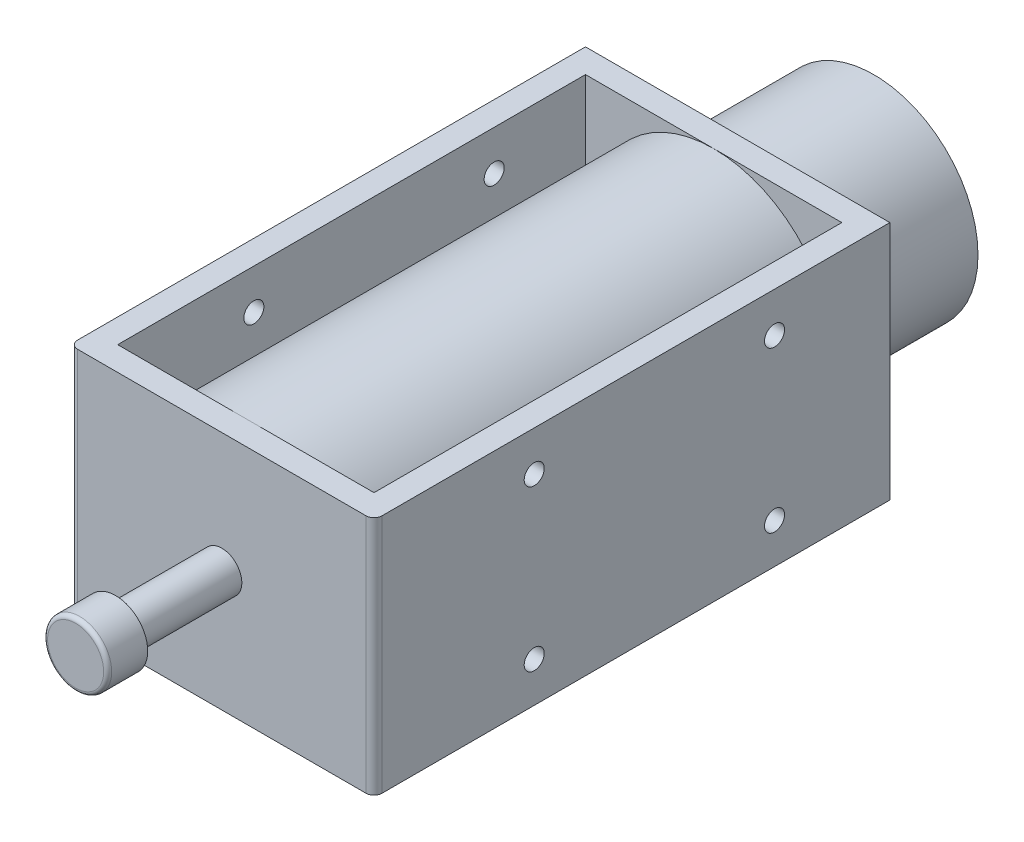
ISO-10303-21;
HEADER;
FILE_DESCRIPTION(('STEP AP214'),'2;1');
FILE_NAME('part.step','',(''),(''),'','','');
FILE_SCHEMA(('AUTOMOTIVE_DESIGN { 1 0 10303 214 1 1 1 1 }'));
ENDSEC;
DATA;
#1=APPLICATION_CONTEXT('core data for automotive mechanical design processes');
#2=APPLICATION_PROTOCOL_DEFINITION('international standard','automotive_design',2000,#1);
#3=PRODUCT_CONTEXT('',#1,'mechanical');
#4=PRODUCT('Part','Part','',(#3));
#5=PRODUCT_RELATED_PRODUCT_CATEGORY('part','',(#4));
#6=PRODUCT_DEFINITION_FORMATION('','',#4);
#7=PRODUCT_DEFINITION_CONTEXT('part definition',#1,'design');
#8=PRODUCT_DEFINITION('design','',#6,#7);
#9=PRODUCT_DEFINITION_SHAPE('','',#8);
#10=(LENGTH_UNIT() NAMED_UNIT(*) SI_UNIT(.MILLI.,.METRE.));
#11=(NAMED_UNIT(*) PLANE_ANGLE_UNIT() SI_UNIT($,.RADIAN.));
#12=(NAMED_UNIT(*) SI_UNIT($,.STERADIAN.) SOLID_ANGLE_UNIT());
#13=UNCERTAINTY_MEASURE_WITH_UNIT(LENGTH_MEASURE(1.E-05),#10,'distance_accuracy_value','');
#14=(GEOMETRIC_REPRESENTATION_CONTEXT(3) GLOBAL_UNCERTAINTY_ASSIGNED_CONTEXT((#13)) GLOBAL_UNIT_ASSIGNED_CONTEXT((#10,
#11,#12)) REPRESENTATION_CONTEXT('',''));
#15=CARTESIAN_POINT('',(0.,0.,0.));
#16=DIRECTION('',(0.,0.,1.));
#17=DIRECTION('',(1.,0.,0.));
#18=AXIS2_PLACEMENT_3D('',#15,#16,#17);
#19=CARTESIAN_POINT('',(19.,-15.,64.4));
#20=DIRECTION('',(-1.,0.,0.));
#21=DIRECTION('',(0.,0.,1.));
#22=AXIS2_PLACEMENT_3D('',#19,#20,#21);
#23=PLANE('',#22);
#24=CARTESIAN_POINT('',(19.,-10.,14.4));
#25=DIRECTION('',(1.,0.,0.));
#26=DIRECTION('',(0.,0.,-1.));
#27=AXIS2_PLACEMENT_3D('',#24,#25,#26);
#28=CIRCLE('',#27,1.24999999999999);
#29=CARTESIAN_POINT('',(19.,-10.,13.15));
#30=VERTEX_POINT('',#29);
#31=EDGE_CURVE('E401',#30,#30,#28,.T.);
#32=ORIENTED_EDGE('',*,*,#31,.F.);
#33=EDGE_LOOP('',(#32));
#34=FACE_BOUND('',#33,.T.);
#35=CARTESIAN_POINT('',(19.,-10.,44.4));
#36=DIRECTION('',(1.,0.,0.));
#37=DIRECTION('',(0.,0.,-1.));
#38=AXIS2_PLACEMENT_3D('',#35,#36,#37);
#39=CIRCLE('',#38,1.24999999999999);
#40=CARTESIAN_POINT('',(19.,-10.,43.15));
#41=VERTEX_POINT('',#40);
#42=EDGE_CURVE('E407',#41,#41,#39,.T.);
#43=ORIENTED_EDGE('',*,*,#42,.F.);
#44=EDGE_LOOP('',(#43));
#45=FACE_BOUND('',#44,.T.);
#46=CARTESIAN_POINT('',(19.,10.,44.4));
#47=DIRECTION('',(1.,0.,0.));
#48=DIRECTION('',(0.,0.,-1.));
#49=AXIS2_PLACEMENT_3D('',#46,#47,#48);
#50=CIRCLE('',#49,1.24999999999999);
#51=CARTESIAN_POINT('',(19.,10.,43.15));
#52=VERTEX_POINT('',#51);
#53=EDGE_CURVE('E413',#52,#52,#50,.T.);
#54=ORIENTED_EDGE('',*,*,#53,.F.);
#55=EDGE_LOOP('',(#54));
#56=FACE_BOUND('',#55,.T.);
#57=DIRECTION('',(0.,0.,-1.));
#58=VECTOR('',#57,1.);
#59=CARTESIAN_POINT('',(19.,15.,64.4));
#60=LINE('',#59,#58);
#61=CARTESIAN_POINT('',(19.,15.,63.4));
#62=VERTEX_POINT('',#61);
#63=CARTESIAN_POINT('',(19.,15.,0.));
#64=VERTEX_POINT('',#63);
#65=EDGE_CURVE('E160',#62,#64,#60,.T.);
#66=ORIENTED_EDGE('',*,*,#65,.F.);
#67=DIRECTION('',(0.,1.,0.));
#68=VECTOR('',#67,1.);
#69=CARTESIAN_POINT('',(19.,-15.,63.4));
#70=LINE('',#69,#68);
#71=CARTESIAN_POINT('',(19.,-15.,63.4));
#72=VERTEX_POINT('',#71);
#73=EDGE_CURVE('E64',#62,#72,#70,.F.);
#74=ORIENTED_EDGE('',*,*,#73,.T.);
#75=DIRECTION('',(0.,0.,-1.));
#76=VECTOR('',#75,1.);
#77=CARTESIAN_POINT('',(19.,-15.,64.4));
#78=LINE('',#77,#76);
#79=CARTESIAN_POINT('',(19.,-15.,0.));
#80=VERTEX_POINT('',#79);
#81=EDGE_CURVE('E214',#72,#80,#78,.T.);
#82=ORIENTED_EDGE('',*,*,#81,.T.);
#83=DIRECTION('',(0.,1.,0.));
#84=VECTOR('',#83,1.);
#85=CARTESIAN_POINT('',(19.,-15.,0.));
#86=LINE('',#85,#84);
#87=EDGE_CURVE('E204',#80,#64,#86,.T.);
#88=ORIENTED_EDGE('',*,*,#87,.T.);
#89=EDGE_LOOP('',(#66,#74,#82,#88));
#90=FACE_BOUND('',#89,.T.);
#91=CARTESIAN_POINT('',(19.,10.,14.4));
#92=DIRECTION('',(1.,0.,0.));
#93=DIRECTION('',(0.,0.,-1.));
#94=AXIS2_PLACEMENT_3D('',#91,#92,#93);
#95=CIRCLE('',#94,1.24999999999999);
#96=CARTESIAN_POINT('',(19.,10.,13.15));
#97=VERTEX_POINT('',#96);
#98=EDGE_CURVE('E389',#97,#97,#95,.T.);
#99=ORIENTED_EDGE('',*,*,#98,.F.);
#100=EDGE_LOOP('',(#99));
#101=FACE_BOUND('',#100,.T.);
#102=ADVANCED_FACE('F41',(#34,#45,#56,#90,#101),#23,.F.);
#103=CARTESIAN_POINT('',(-19.,-15.,64.4));
#104=DIRECTION('',(1.,0.,0.));
#105=DIRECTION('',(0.,0.,-1.));
#106=AXIS2_PLACEMENT_3D('',#103,#104,#105);
#107=PLANE('',#106);
#108=CARTESIAN_POINT('',(-19.,10.,44.4));
#109=DIRECTION('',(-1.,0.,0.));
#110=DIRECTION('',(0.,0.,1.));
#111=AXIS2_PLACEMENT_3D('',#108,#109,#110);
#112=CIRCLE('',#111,1.25);
#113=CARTESIAN_POINT('',(-19.,10.,45.65));
#114=VERTEX_POINT('',#113);
#115=EDGE_CURVE('E431',#114,#114,#112,.T.);
#116=ORIENTED_EDGE('',*,*,#115,.F.);
#117=EDGE_LOOP('',(#116));
#118=FACE_BOUND('',#117,.T.);
#119=CARTESIAN_POINT('',(-19.,10.,14.4));
#120=DIRECTION('',(-1.,0.,0.));
#121=DIRECTION('',(0.,0.,1.));
#122=AXIS2_PLACEMENT_3D('',#119,#120,#121);
#123=CIRCLE('',#122,1.25);
#124=CARTESIAN_POINT('',(-19.,10.,15.65));
#125=VERTEX_POINT('',#124);
#126=EDGE_CURVE('E170',#125,#125,#123,.T.);
#127=ORIENTED_EDGE('',*,*,#126,.F.);
#128=EDGE_LOOP('',(#127));
#129=FACE_BOUND('',#128,.T.);
#130=DIRECTION('',(0.,0.,-1.));
#131=VECTOR('',#130,1.);
#132=CARTESIAN_POINT('',(-19.,-15.,64.4));
#133=LINE('',#132,#131);
#134=CARTESIAN_POINT('',(-19.,-15.,63.4));
#135=VERTEX_POINT('',#134);
#136=CARTESIAN_POINT('',(-19.,-15.,0.));
#137=VERTEX_POINT('',#136);
#138=EDGE_CURVE('E226',#135,#137,#133,.T.);
#139=ORIENTED_EDGE('',*,*,#138,.F.);
#140=DIRECTION('',(0.,-1.,0.));
#141=VECTOR('',#140,1.);
#142=CARTESIAN_POINT('',(-19.,-15.,63.4));
#143=LINE('',#142,#141);
#144=CARTESIAN_POINT('',(-19.,15.,63.4));
#145=VERTEX_POINT('',#144);
#146=EDGE_CURVE('E244',#135,#145,#143,.F.);
#147=ORIENTED_EDGE('',*,*,#146,.T.);
#148=DIRECTION('',(0.,0.,-1.));
#149=VECTOR('',#148,1.);
#150=CARTESIAN_POINT('',(-19.,15.,64.4));
#151=LINE('',#150,#149);
#152=CARTESIAN_POINT('',(-19.,15.,0.));
#153=VERTEX_POINT('',#152);
#154=EDGE_CURVE('E228',#145,#153,#151,.T.);
#155=ORIENTED_EDGE('',*,*,#154,.T.);
#156=DIRECTION('',(0.,-1.,0.));
#157=VECTOR('',#156,1.);
#158=CARTESIAN_POINT('',(-19.,-15.,0.));
#159=LINE('',#158,#157);
#160=EDGE_CURVE('E220',#153,#137,#159,.T.);
#161=ORIENTED_EDGE('',*,*,#160,.T.);
#162=EDGE_LOOP('',(#139,#147,#155,#161));
#163=FACE_BOUND('',#162,.T.);
#164=CARTESIAN_POINT('',(-19.,-10.,44.4));
#165=DIRECTION('',(-1.,0.,0.));
#166=DIRECTION('',(0.,0.,1.));
#167=AXIS2_PLACEMENT_3D('',#164,#165,#166);
#168=CIRCLE('',#167,1.25);
#169=CARTESIAN_POINT('',(-19.,-10.,45.65));
#170=VERTEX_POINT('',#169);
#171=EDGE_CURVE('E425',#170,#170,#168,.T.);
#172=ORIENTED_EDGE('',*,*,#171,.F.);
#173=EDGE_LOOP('',(#172));
#174=FACE_BOUND('',#173,.T.);
#175=CARTESIAN_POINT('',(-19.,-10.,14.4));
#176=DIRECTION('',(-1.,0.,0.));
#177=DIRECTION('',(0.,0.,1.));
#178=AXIS2_PLACEMENT_3D('',#175,#176,#177);
#179=CIRCLE('',#178,1.25);
#180=CARTESIAN_POINT('',(-19.,-10.,15.65));
#181=VERTEX_POINT('',#180);
#182=EDGE_CURVE('E419',#181,#181,#179,.T.);
#183=ORIENTED_EDGE('',*,*,#182,.F.);
#184=EDGE_LOOP('',(#183));
#185=FACE_BOUND('',#184,.T.);
#186=ADVANCED_FACE('F261',(#118,#129,#163,#174,#185),#107,.F.);
#187=CARTESIAN_POINT('',(-16.,15.,3.));
#188=DIRECTION('',(0.,0.,-1.));
#189=DIRECTION('',(-1.,0.,0.));
#190=AXIS2_PLACEMENT_3D('',#187,#188,#189);
#191=PLANE('',#190);
#192=CARTESIAN_POINT('',(0.,0.,3.));
#193=DIRECTION('',(0.,0.,-1.));
#194=DIRECTION('',(-1.,0.,0.));
#195=AXIS2_PLACEMENT_3D('',#192,#193,#194);
#196=CIRCLE('',#195,15.);
#197=CARTESIAN_POINT('',(0.,15.,3.));
#198=VERTEX_POINT('',#197);
#199=CARTESIAN_POINT('',(0.,-15.,3.));
#200=VERTEX_POINT('',#199);
#201=EDGE_CURVE('E167',#198,#200,#196,.T.);
#202=ORIENTED_EDGE('',*,*,#201,.T.);
#203=DIRECTION('',(1.,0.,0.));
#204=VECTOR('',#203,1.);
#205=CARTESIAN_POINT('',(-16.,-15.,3.));
#206=LINE('',#205,#204);
#207=CARTESIAN_POINT('',(16.,-15.,3.));
#208=VERTEX_POINT('',#207);
#209=EDGE_CURVE('E190',#200,#208,#206,.T.);
#210=ORIENTED_EDGE('',*,*,#209,.T.);
#211=DIRECTION('',(0.,-1.,0.));
#212=VECTOR('',#211,1.);
#213=CARTESIAN_POINT('',(16.,15.,3.));
#214=LINE('',#213,#212);
#215=CARTESIAN_POINT('',(16.,15.,3.));
#216=VERTEX_POINT('',#215);
#217=EDGE_CURVE('E192',#216,#208,#214,.T.);
#218=ORIENTED_EDGE('',*,*,#217,.F.);
#219=DIRECTION('',(1.,0.,0.));
#220=VECTOR('',#219,1.);
#221=CARTESIAN_POINT('',(-16.,15.,3.));
#222=LINE('',#221,#220);
#223=EDGE_CURVE('E184',#198,#216,#222,.T.);
#224=ORIENTED_EDGE('',*,*,#223,.F.);
#225=EDGE_LOOP('',(#202,#210,#218,#224));
#226=FACE_BOUND('',#225,.T.);
#227=ADVANCED_FACE('F267',(#226),#191,.F.);
#228=CARTESIAN_POINT('',(16.,15.,61.4));
#229=DIRECTION('',(0.,0.,1.));
#230=DIRECTION('',(1.,0.,0.));
#231=AXIS2_PLACEMENT_3D('',#228,#229,#230);
#232=PLANE('',#231);
#233=CARTESIAN_POINT('',(0.,0.,61.4));
#234=DIRECTION('',(0.,0.,1.));
#235=DIRECTION('',(1.,0.,0.));
#236=AXIS2_PLACEMENT_3D('',#233,#234,#235);
#237=CIRCLE('',#236,15.);
#238=CARTESIAN_POINT('',(0.,-15.,61.4));
#239=VERTEX_POINT('',#238);
#240=CARTESIAN_POINT('',(0.,15.,61.4));
#241=VERTEX_POINT('',#240);
#242=EDGE_CURVE('E154',#239,#241,#237,.F.);
#243=ORIENTED_EDGE('',*,*,#242,.F.);
#244=DIRECTION('',(-1.,0.,0.));
#245=VECTOR('',#244,1.);
#246=CARTESIAN_POINT('',(16.,-15.,61.4));
#247=LINE('',#246,#245);
#248=CARTESIAN_POINT('',(-16.,-15.,61.4));
#249=VERTEX_POINT('',#248);
#250=EDGE_CURVE('E142',#239,#249,#247,.T.);
#251=ORIENTED_EDGE('',*,*,#250,.T.);
#252=DIRECTION('',(0.,-1.,0.));
#253=VECTOR('',#252,1.);
#254=CARTESIAN_POINT('',(-16.,15.,61.4));
#255=LINE('',#254,#253);
#256=CARTESIAN_POINT('',(-16.,15.,61.4));
#257=VERTEX_POINT('',#256);
#258=EDGE_CURVE('E198',#257,#249,#255,.T.);
#259=ORIENTED_EDGE('',*,*,#258,.F.);
#260=DIRECTION('',(-1.,0.,0.));
#261=VECTOR('',#260,1.);
#262=CARTESIAN_POINT('',(16.,15.,61.4));
#263=LINE('',#262,#261);
#264=EDGE_CURVE('E156',#241,#257,#263,.T.);
#265=ORIENTED_EDGE('',*,*,#264,.F.);
#266=EDGE_LOOP('',(#243,#251,#259,#265));
#267=FACE_BOUND('',#266,.T.);
#268=ADVANCED_FACE('F155',(#267),#232,.F.);
#269=CARTESIAN_POINT('',(-19.,15.,64.4));
#270=DIRECTION('',(0.,-1.,0.));
#271=DIRECTION('',(0.,0.,-1.));
#272=AXIS2_PLACEMENT_3D('',#269,#270,#271);
#273=PLANE('',#272);
#274=CARTESIAN_POINT('',(-16.,15.,3.));
#275=VERTEX_POINT('',#274);
#276=EDGE_CURVE('E185',#275,#198,#222,.T.);
#277=ORIENTED_EDGE('',*,*,#276,.T.);
#278=ORIENTED_EDGE('',*,*,#223,.T.);
#279=DIRECTION('',(0.,0.,1.));
#280=VECTOR('',#279,1.);
#281=CARTESIAN_POINT('',(16.,15.,3.));
#282=LINE('',#281,#280);
#283=CARTESIAN_POINT('',(16.,15.,61.4));
#284=VERTEX_POINT('',#283);
#285=EDGE_CURVE('E175',#216,#284,#282,.T.);
#286=ORIENTED_EDGE('',*,*,#285,.T.);
#287=EDGE_CURVE('E179',#284,#241,#263,.T.);
#288=ORIENTED_EDGE('',*,*,#287,.T.);
#289=ORIENTED_EDGE('',*,*,#264,.T.);
#290=DIRECTION('',(0.,0.,-1.));
#291=VECTOR('',#290,1.);
#292=CARTESIAN_POINT('',(-16.,15.,61.4));
#293=LINE('',#292,#291);
#294=EDGE_CURVE('E181',#257,#275,#293,.T.);
#295=ORIENTED_EDGE('',*,*,#294,.T.);
#296=EDGE_LOOP('',(#277,#278,#286,#288,#289,#295));
#297=FACE_BOUND('',#296,.T.);
#298=DIRECTION('',(-1.,0.,0.));
#299=VECTOR('',#298,1.);
#300=CARTESIAN_POINT('',(-19.,15.,64.4));
#301=LINE('',#300,#299);
#302=CARTESIAN_POINT('',(18.,15.,64.4));
#303=VERTEX_POINT('',#302);
#304=CARTESIAN_POINT('',(-18.,15.,64.4));
#305=VERTEX_POINT('',#304);
#306=EDGE_CURVE('E207',#303,#305,#301,.T.);
#307=ORIENTED_EDGE('',*,*,#306,.F.);
#308=CARTESIAN_POINT('',(18.,15.,63.4));
#309=DIRECTION('',(0.,-1.,0.));
#310=DIRECTION('',(0.,0.,-1.));
#311=AXIS2_PLACEMENT_3D('',#308,#309,#310);
#312=CIRCLE('',#311,1.);
#313=EDGE_CURVE('E238',#303,#62,#312,.F.);
#314=ORIENTED_EDGE('',*,*,#313,.T.);
#315=ORIENTED_EDGE('',*,*,#65,.T.);
#316=DIRECTION('',(-1.,0.,0.));
#317=VECTOR('',#316,1.);
#318=CARTESIAN_POINT('',(-19.,15.,0.));
#319=LINE('',#318,#317);
#320=EDGE_CURVE('E217',#64,#153,#319,.T.);
#321=ORIENTED_EDGE('',*,*,#320,.T.);
#322=ORIENTED_EDGE('',*,*,#154,.F.);
#323=CARTESIAN_POINT('',(-18.,15.,63.4));
#324=DIRECTION('',(0.,-1.,0.));
#325=DIRECTION('',(0.,0.,-1.));
#326=AXIS2_PLACEMENT_3D('',#323,#324,#325);
#327=CIRCLE('',#326,1.);
#328=EDGE_CURVE('E236',#145,#305,#327,.F.);
#329=ORIENTED_EDGE('',*,*,#328,.T.);
#330=EDGE_LOOP('',(#307,#314,#315,#321,#322,#329));
#331=FACE_BOUND('',#330,.T.);
#332=ADVANCED_FACE('F274',(#297,#331),#273,.F.);
#333=CARTESIAN_POINT('',(-19.,-15.,64.4));
#334=DIRECTION('',(0.,1.,0.));
#335=DIRECTION('',(0.,0.,1.));
#336=AXIS2_PLACEMENT_3D('',#333,#334,#335);
#337=PLANE('',#336);
#338=CARTESIAN_POINT('',(16.,-15.,61.4));
#339=VERTEX_POINT('',#338);
#340=EDGE_CURVE('E131',#339,#239,#247,.T.);
#341=ORIENTED_EDGE('',*,*,#340,.F.);
#342=DIRECTION('',(0.,0.,1.));
#343=VECTOR('',#342,1.);
#344=CARTESIAN_POINT('',(16.,-15.,3.));
#345=LINE('',#344,#343);
#346=EDGE_CURVE('E152',#208,#339,#345,.T.);
#347=ORIENTED_EDGE('',*,*,#346,.F.);
#348=ORIENTED_EDGE('',*,*,#209,.F.);
#349=CARTESIAN_POINT('',(-16.,-15.,3.));
#350=VERTEX_POINT('',#349);
#351=EDGE_CURVE('E178',#350,#200,#206,.T.);
#352=ORIENTED_EDGE('',*,*,#351,.F.);
#353=DIRECTION('',(0.,0.,-1.));
#354=VECTOR('',#353,1.);
#355=CARTESIAN_POINT('',(-16.,-15.,61.4));
#356=LINE('',#355,#354);
#357=EDGE_CURVE('E141',#249,#350,#356,.T.);
#358=ORIENTED_EDGE('',*,*,#357,.F.);
#359=ORIENTED_EDGE('',*,*,#250,.F.);
#360=EDGE_LOOP('',(#341,#347,#348,#352,#358,#359));
#361=FACE_BOUND('',#360,.T.);
#362=ORIENTED_EDGE('',*,*,#81,.F.);
#363=CARTESIAN_POINT('',(18.,-15.,63.4));
#364=DIRECTION('',(0.,1.,0.));
#365=DIRECTION('',(0.,0.,1.));
#366=AXIS2_PLACEMENT_3D('',#363,#364,#365);
#367=CIRCLE('',#366,1.);
#368=CARTESIAN_POINT('',(18.,-15.,64.4));
#369=VERTEX_POINT('',#368);
#370=EDGE_CURVE('E242',#72,#369,#367,.F.);
#371=ORIENTED_EDGE('',*,*,#370,.T.);
#372=DIRECTION('',(1.,0.,0.));
#373=VECTOR('',#372,1.);
#374=CARTESIAN_POINT('',(-19.,-15.,64.4));
#375=LINE('',#374,#373);
#376=CARTESIAN_POINT('',(-18.,-15.,64.4));
#377=VERTEX_POINT('',#376);
#378=EDGE_CURVE('E210',#377,#369,#375,.T.);
#379=ORIENTED_EDGE('',*,*,#378,.F.);
#380=CARTESIAN_POINT('',(-18.,-15.,63.4));
#381=DIRECTION('',(0.,1.,0.));
#382=DIRECTION('',(0.,0.,1.));
#383=AXIS2_PLACEMENT_3D('',#380,#381,#382);
#384=CIRCLE('',#383,1.);
#385=EDGE_CURVE('E56',#377,#135,#384,.F.);
#386=ORIENTED_EDGE('',*,*,#385,.T.);
#387=ORIENTED_EDGE('',*,*,#138,.T.);
#388=DIRECTION('',(1.,0.,0.));
#389=VECTOR('',#388,1.);
#390=CARTESIAN_POINT('',(-19.,-15.,0.));
#391=LINE('',#390,#389);
#392=EDGE_CURVE('E211',#137,#80,#391,.T.);
#393=ORIENTED_EDGE('',*,*,#392,.T.);
#394=EDGE_LOOP('',(#362,#371,#379,#386,#387,#393));
#395=FACE_BOUND('',#394,.T.);
#396=ADVANCED_FACE('F146',(#361,#395),#337,.F.);
#397=CARTESIAN_POINT('',(0.,0.,64.4));
#398=DIRECTION('',(0.,0.,-1.));
#399=DIRECTION('',(-1.,0.,0.));
#400=AXIS2_PLACEMENT_3D('',#397,#398,#399);
#401=PLANE('',#400);
#402=ORIENTED_EDGE('',*,*,#378,.T.);
#403=DIRECTION('',(0.,1.,0.));
#404=VECTOR('',#403,1.);
#405=CARTESIAN_POINT('',(18.,0.,64.4));
#406=LINE('',#405,#404);
#407=EDGE_CURVE('E233',#369,#303,#406,.T.);
#408=ORIENTED_EDGE('',*,*,#407,.T.);
#409=ORIENTED_EDGE('',*,*,#306,.T.);
#410=DIRECTION('',(0.,-1.,0.));
#411=VECTOR('',#410,1.);
#412=CARTESIAN_POINT('',(-18.,0.,64.4));
#413=LINE('',#412,#411);
#414=EDGE_CURVE('E159',#305,#377,#413,.T.);
#415=ORIENTED_EDGE('',*,*,#414,.T.);
#416=EDGE_LOOP('',(#402,#408,#409,#415));
#417=FACE_BOUND('',#416,.T.);
#418=CARTESIAN_POINT('',(0.,0.,64.4));
#419=DIRECTION('',(0.,0.,1.));
#420=DIRECTION('',(1.,0.,0.));
#421=AXIS2_PLACEMENT_3D('',#418,#419,#420);
#422=CIRCLE('',#421,2.5);
#423=CARTESIAN_POINT('',(2.5,0.,64.4));
#424=VERTEX_POINT('',#423);
#425=EDGE_CURVE('E390',#424,#424,#422,.T.);
#426=ORIENTED_EDGE('',*,*,#425,.F.);
#427=EDGE_LOOP('',(#426));
#428=FACE_BOUND('',#427,.T.);
#429=ADVANCED_FACE('F295',(#417,#428),#401,.F.);
#430=CARTESIAN_POINT('',(0.,0.,0.));
#431=DIRECTION('',(0.,0.,-1.));
#432=DIRECTION('',(-1.,0.,0.));
#433=AXIS2_PLACEMENT_3D('',#430,#431,#432);
#434=PLANE('',#433);
#435=CARTESIAN_POINT('',(0.,0.,0.));
#436=DIRECTION('',(0.,0.,-1.));
#437=DIRECTION('',(-1.,0.,0.));
#438=AXIS2_PLACEMENT_3D('',#435,#436,#437);
#439=CIRCLE('',#438,13.);
#440=CARTESIAN_POINT('',(-13.,0.,0.));
#441=VERTEX_POINT('',#440);
#442=EDGE_CURVE('E195',#441,#441,#439,.T.);
#443=ORIENTED_EDGE('',*,*,#442,.F.);
#444=EDGE_LOOP('',(#443));
#445=FACE_BOUND('',#444,.T.);
#446=ORIENTED_EDGE('',*,*,#87,.F.);
#447=ORIENTED_EDGE('',*,*,#392,.F.);
#448=ORIENTED_EDGE('',*,*,#160,.F.);
#449=ORIENTED_EDGE('',*,*,#320,.F.);
#450=EDGE_LOOP('',(#446,#447,#448,#449));
#451=FACE_BOUND('',#450,.T.);
#452=ADVANCED_FACE('F304',(#445,#451),#434,.T.);
#453=CARTESIAN_POINT('',(0.,0.,-17.));
#454=DIRECTION('',(0.,0.,1.));
#455=DIRECTION('',(1.,0.,0.));
#456=AXIS2_PLACEMENT_3D('',#453,#454,#455);
#457=CYLINDRICAL_SURFACE('',#456,13.);
#458=CARTESIAN_POINT('',(0.,0.,-17.));
#459=DIRECTION('',(0.,0.,-1.));
#460=DIRECTION('',(-1.,0.,0.));
#461=AXIS2_PLACEMENT_3D('',#458,#459,#460);
#462=CIRCLE('',#461,13.);
#463=CARTESIAN_POINT('',(-13.,0.,-17.));
#464=VERTEX_POINT('',#463);
#465=EDGE_CURVE('E201',#464,#464,#462,.T.);
#466=ORIENTED_EDGE('',*,*,#465,.F.);
#467=EDGE_LOOP('',(#466));
#468=FACE_BOUND('',#467,.T.);
#469=ORIENTED_EDGE('',*,*,#442,.T.);
#470=EDGE_LOOP('',(#469));
#471=FACE_BOUND('',#470,.T.);
#472=ADVANCED_FACE('F318',(#468,#471),#457,.T.);
#473=CARTESIAN_POINT('',(0.,0.,-17.));
#474=DIRECTION('',(0.,0.,-1.));
#475=DIRECTION('',(-1.,0.,0.));
#476=AXIS2_PLACEMENT_3D('',#473,#474,#475);
#477=PLANE('',#476);
#478=ORIENTED_EDGE('',*,*,#465,.T.);
#479=EDGE_LOOP('',(#478));
#480=FACE_BOUND('',#479,.T.);
#481=ADVANCED_FACE('F323',(#480),#477,.T.);
#482=CARTESIAN_POINT('',(16.,15.,3.));
#483=DIRECTION('',(1.,0.,0.));
#484=DIRECTION('',(0.,0.,-1.));
#485=AXIS2_PLACEMENT_3D('',#482,#483,#484);
#486=PLANE('',#485);
#487=CARTESIAN_POINT('',(16.,10.,14.4));
#488=DIRECTION('',(1.,0.,0.));
#489=DIRECTION('',(0.,0.,-1.));
#490=AXIS2_PLACEMENT_3D('',#487,#488,#489);
#491=CIRCLE('',#490,1.24999999999999);
#492=CARTESIAN_POINT('',(16.,10.,13.15));
#493=VERTEX_POINT('',#492);
#494=EDGE_CURVE('E393',#493,#493,#491,.T.);
#495=ORIENTED_EDGE('',*,*,#494,.T.);
#496=EDGE_LOOP('',(#495));
#497=FACE_BOUND('',#496,.T.);
#498=CARTESIAN_POINT('',(16.,-10.,14.4));
#499=DIRECTION('',(1.,0.,0.));
#500=DIRECTION('',(0.,0.,-1.));
#501=AXIS2_PLACEMENT_3D('',#498,#499,#500);
#502=CIRCLE('',#501,1.24999999999999);
#503=CARTESIAN_POINT('',(16.,-10.,13.15));
#504=VERTEX_POINT('',#503);
#505=EDGE_CURVE('E404',#504,#504,#502,.T.);
#506=ORIENTED_EDGE('',*,*,#505,.T.);
#507=EDGE_LOOP('',(#506));
#508=FACE_BOUND('',#507,.T.);
#509=CARTESIAN_POINT('',(16.,-10.,44.4));
#510=DIRECTION('',(1.,0.,0.));
#511=DIRECTION('',(0.,0.,-1.));
#512=AXIS2_PLACEMENT_3D('',#509,#510,#511);
#513=CIRCLE('',#512,1.24999999999999);
#514=CARTESIAN_POINT('',(16.,-10.,43.15));
#515=VERTEX_POINT('',#514);
#516=EDGE_CURVE('E410',#515,#515,#513,.T.);
#517=ORIENTED_EDGE('',*,*,#516,.T.);
#518=EDGE_LOOP('',(#517));
#519=FACE_BOUND('',#518,.T.);
#520=CARTESIAN_POINT('',(16.,10.,44.4));
#521=DIRECTION('',(1.,0.,0.));
#522=DIRECTION('',(0.,0.,-1.));
#523=AXIS2_PLACEMENT_3D('',#520,#521,#522);
#524=CIRCLE('',#523,1.24999999999999);
#525=CARTESIAN_POINT('',(16.,10.,43.15));
#526=VERTEX_POINT('',#525);
#527=EDGE_CURVE('E416',#526,#526,#524,.T.);
#528=ORIENTED_EDGE('',*,*,#527,.T.);
#529=EDGE_LOOP('',(#528));
#530=FACE_BOUND('',#529,.T.);
#531=ORIENTED_EDGE('',*,*,#346,.T.);
#532=DIRECTION('',(0.,-1.,0.));
#533=VECTOR('',#532,1.);
#534=CARTESIAN_POINT('',(16.,15.,61.4));
#535=LINE('',#534,#533);
#536=EDGE_CURVE('E138',#284,#339,#535,.T.);
#537=ORIENTED_EDGE('',*,*,#536,.F.);
#538=ORIENTED_EDGE('',*,*,#285,.F.);
#539=ORIENTED_EDGE('',*,*,#217,.T.);
#540=EDGE_LOOP('',(#531,#537,#538,#539));
#541=FACE_BOUND('',#540,.T.);
#542=ADVANCED_FACE('F326',(#497,#508,#519,#530,#541),#486,.F.);
#543=EDGE_CURVE('E164',#200,#198,#196,.T.);
#544=ORIENTED_EDGE('',*,*,#543,.T.);
#545=ORIENTED_EDGE('',*,*,#276,.F.);
#546=DIRECTION('',(0.,-1.,0.));
#547=VECTOR('',#546,1.);
#548=CARTESIAN_POINT('',(-16.,15.,3.));
#549=LINE('',#548,#547);
#550=EDGE_CURVE('E196',#275,#350,#549,.T.);
#551=ORIENTED_EDGE('',*,*,#550,.T.);
#552=ORIENTED_EDGE('',*,*,#351,.T.);
#553=EDGE_LOOP('',(#544,#545,#551,#552));
#554=FACE_BOUND('',#553,.T.);
#555=ADVANCED_FACE('F334',(#554),#191,.F.);
#556=CARTESIAN_POINT('',(-16.,15.,61.4));
#557=DIRECTION('',(-1.,0.,0.));
#558=DIRECTION('',(0.,0.,1.));
#559=AXIS2_PLACEMENT_3D('',#556,#557,#558);
#560=PLANE('',#559);
#561=CARTESIAN_POINT('',(-16.,-10.,14.4));
#562=DIRECTION('',(-1.,0.,0.));
#563=DIRECTION('',(0.,0.,1.));
#564=AXIS2_PLACEMENT_3D('',#561,#562,#563);
#565=CIRCLE('',#564,1.25);
#566=CARTESIAN_POINT('',(-16.,-10.,15.65));
#567=VERTEX_POINT('',#566);
#568=EDGE_CURVE('E422',#567,#567,#565,.T.);
#569=ORIENTED_EDGE('',*,*,#568,.T.);
#570=EDGE_LOOP('',(#569));
#571=FACE_BOUND('',#570,.T.);
#572=CARTESIAN_POINT('',(-16.,-10.,44.4));
#573=DIRECTION('',(-1.,0.,0.));
#574=DIRECTION('',(0.,0.,1.));
#575=AXIS2_PLACEMENT_3D('',#572,#573,#574);
#576=CIRCLE('',#575,1.25);
#577=CARTESIAN_POINT('',(-16.,-10.,45.65));
#578=VERTEX_POINT('',#577);
#579=EDGE_CURVE('E428',#578,#578,#576,.T.);
#580=ORIENTED_EDGE('',*,*,#579,.T.);
#581=EDGE_LOOP('',(#580));
#582=FACE_BOUND('',#581,.T.);
#583=CARTESIAN_POINT('',(-16.,10.,44.4));
#584=DIRECTION('',(-1.,0.,0.));
#585=DIRECTION('',(0.,0.,1.));
#586=AXIS2_PLACEMENT_3D('',#583,#584,#585);
#587=CIRCLE('',#586,1.25);
#588=CARTESIAN_POINT('',(-16.,10.,45.65));
#589=VERTEX_POINT('',#588);
#590=EDGE_CURVE('E434',#589,#589,#587,.T.);
#591=ORIENTED_EDGE('',*,*,#590,.T.);
#592=EDGE_LOOP('',(#591));
#593=FACE_BOUND('',#592,.T.);
#594=CARTESIAN_POINT('',(-16.,10.,14.4));
#595=DIRECTION('',(-1.,0.,0.));
#596=DIRECTION('',(0.,0.,1.));
#597=AXIS2_PLACEMENT_3D('',#594,#595,#596);
#598=CIRCLE('',#597,1.25);
#599=CARTESIAN_POINT('',(-16.,10.,15.65));
#600=VERTEX_POINT('',#599);
#601=EDGE_CURVE('E165',#600,#600,#598,.T.);
#602=ORIENTED_EDGE('',*,*,#601,.T.);
#603=EDGE_LOOP('',(#602));
#604=FACE_BOUND('',#603,.T.);
#605=ORIENTED_EDGE('',*,*,#357,.T.);
#606=ORIENTED_EDGE('',*,*,#550,.F.);
#607=ORIENTED_EDGE('',*,*,#294,.F.);
#608=ORIENTED_EDGE('',*,*,#258,.T.);
#609=EDGE_LOOP('',(#605,#606,#607,#608));
#610=FACE_BOUND('',#609,.T.);
#611=ADVANCED_FACE('F338',(#571,#582,#593,#604,#610),#560,.F.);
#612=CARTESIAN_POINT('',(0.,0.,61.4));
#613=DIRECTION('',(0.,0.,-1.));
#614=DIRECTION('',(-1.,0.,0.));
#615=AXIS2_PLACEMENT_3D('',#612,#613,#614);
#616=CIRCLE('',#615,15.);
#617=EDGE_CURVE('E136',#241,#239,#616,.T.);
#618=ORIENTED_EDGE('',*,*,#617,.F.);
#619=ORIENTED_EDGE('',*,*,#287,.F.);
#620=ORIENTED_EDGE('',*,*,#536,.T.);
#621=ORIENTED_EDGE('',*,*,#340,.T.);
#622=EDGE_LOOP('',(#618,#619,#620,#621));
#623=FACE_BOUND('',#622,.T.);
#624=ADVANCED_FACE('F133',(#623),#232,.F.);
#625=CARTESIAN_POINT('',(0.,0.,-39.4264068711929));
#626=DIRECTION('',(0.,0.,1.));
#627=DIRECTION('',(1.,0.,0.));
#628=AXIS2_PLACEMENT_3D('',#625,#626,#627);
#629=CYLINDRICAL_SURFACE('',#628,15.);
#630=ORIENTED_EDGE('',*,*,#617,.T.);
#631=ORIENTED_EDGE('',*,*,#242,.T.);
#632=EDGE_LOOP('',(#630,#631));
#633=FACE_BOUND('',#632,.T.);
#634=ORIENTED_EDGE('',*,*,#201,.F.);
#635=ORIENTED_EDGE('',*,*,#543,.F.);
#636=EDGE_LOOP('',(#634,#635));
#637=FACE_BOUND('',#636,.T.);
#638=ADVANCED_FACE('F162',(#633,#637),#629,.T.);
#639=CARTESIAN_POINT('',(18.,0.,63.4));
#640=DIRECTION('',(0.,1.,0.));
#641=DIRECTION('',(0.,0.,1.));
#642=AXIS2_PLACEMENT_3D('',#639,#640,#641);
#643=CYLINDRICAL_SURFACE('',#642,1.);
#644=ORIENTED_EDGE('',*,*,#370,.F.);
#645=ORIENTED_EDGE('',*,*,#73,.F.);
#646=ORIENTED_EDGE('',*,*,#313,.F.);
#647=ORIENTED_EDGE('',*,*,#407,.F.);
#648=EDGE_LOOP('',(#644,#645,#646,#647));
#649=FACE_BOUND('',#648,.T.);
#650=ADVANCED_FACE('F275',(#649),#643,.T.);
#651=CARTESIAN_POINT('',(-18.,0.,63.4));
#652=DIRECTION('',(0.,-1.,0.));
#653=DIRECTION('',(0.,0.,-1.));
#654=AXIS2_PLACEMENT_3D('',#651,#652,#653);
#655=CYLINDRICAL_SURFACE('',#654,1.);
#656=ORIENTED_EDGE('',*,*,#328,.F.);
#657=ORIENTED_EDGE('',*,*,#146,.F.);
#658=ORIENTED_EDGE('',*,*,#385,.F.);
#659=ORIENTED_EDGE('',*,*,#414,.F.);
#660=EDGE_LOOP('',(#656,#657,#658,#659));
#661=FACE_BOUND('',#660,.T.);
#662=ADVANCED_FACE('F277',(#661),#655,.T.);
#663=CARTESIAN_POINT('',(-19.,10.,14.4));
#664=DIRECTION('',(-1.,0.,0.));
#665=DIRECTION('',(0.,0.,1.));
#666=AXIS2_PLACEMENT_3D('',#663,#664,#665);
#667=CYLINDRICAL_SURFACE('',#666,1.25);
#668=ORIENTED_EDGE('',*,*,#601,.F.);
#669=EDGE_LOOP('',(#668));
#670=FACE_BOUND('',#669,.T.);
#671=ORIENTED_EDGE('',*,*,#126,.T.);
#672=EDGE_LOOP('',(#671));
#673=FACE_BOUND('',#672,.T.);
#674=ADVANCED_FACE('F280',(#670,#673),#667,.F.);
#675=CARTESIAN_POINT('',(-19.,10.,44.4));
#676=DIRECTION('',(-1.,0.,0.));
#677=DIRECTION('',(0.,0.,1.));
#678=AXIS2_PLACEMENT_3D('',#675,#676,#677);
#679=CYLINDRICAL_SURFACE('',#678,1.25);
#680=ORIENTED_EDGE('',*,*,#590,.F.);
#681=EDGE_LOOP('',(#680));
#682=FACE_BOUND('',#681,.T.);
#683=ORIENTED_EDGE('',*,*,#115,.T.);
#684=EDGE_LOOP('',(#683));
#685=FACE_BOUND('',#684,.T.);
#686=ADVANCED_FACE('F285',(#682,#685),#679,.F.);
#687=CARTESIAN_POINT('',(-19.,-10.,44.4));
#688=DIRECTION('',(-1.,0.,0.));
#689=DIRECTION('',(0.,0.,1.));
#690=AXIS2_PLACEMENT_3D('',#687,#688,#689);
#691=CYLINDRICAL_SURFACE('',#690,1.25);
#692=ORIENTED_EDGE('',*,*,#579,.F.);
#693=EDGE_LOOP('',(#692));
#694=FACE_BOUND('',#693,.T.);
#695=ORIENTED_EDGE('',*,*,#171,.T.);
#696=EDGE_LOOP('',(#695));
#697=FACE_BOUND('',#696,.T.);
#698=ADVANCED_FACE('F349',(#694,#697),#691,.F.);
#699=CARTESIAN_POINT('',(-19.,-10.,14.4));
#700=DIRECTION('',(-1.,0.,0.));
#701=DIRECTION('',(0.,0.,1.));
#702=AXIS2_PLACEMENT_3D('',#699,#700,#701);
#703=CYLINDRICAL_SURFACE('',#702,1.25);
#704=ORIENTED_EDGE('',*,*,#568,.F.);
#705=EDGE_LOOP('',(#704));
#706=FACE_BOUND('',#705,.T.);
#707=ORIENTED_EDGE('',*,*,#182,.T.);
#708=EDGE_LOOP('',(#707));
#709=FACE_BOUND('',#708,.T.);
#710=ADVANCED_FACE('F353',(#706,#709),#703,.F.);
#711=CARTESIAN_POINT('',(19.,10.,44.4));
#712=DIRECTION('',(1.,0.,0.));
#713=DIRECTION('',(0.,0.,-1.));
#714=AXIS2_PLACEMENT_3D('',#711,#712,#713);
#715=CYLINDRICAL_SURFACE('',#714,1.24999999999999);
#716=ORIENTED_EDGE('',*,*,#527,.F.);
#717=EDGE_LOOP('',(#716));
#718=FACE_BOUND('',#717,.T.);
#719=ORIENTED_EDGE('',*,*,#53,.T.);
#720=EDGE_LOOP('',(#719));
#721=FACE_BOUND('',#720,.T.);
#722=ADVANCED_FACE('F357',(#718,#721),#715,.F.);
#723=CARTESIAN_POINT('',(19.,-10.,44.4));
#724=DIRECTION('',(1.,0.,0.));
#725=DIRECTION('',(0.,0.,-1.));
#726=AXIS2_PLACEMENT_3D('',#723,#724,#725);
#727=CYLINDRICAL_SURFACE('',#726,1.24999999999999);
#728=ORIENTED_EDGE('',*,*,#516,.F.);
#729=EDGE_LOOP('',(#728));
#730=FACE_BOUND('',#729,.T.);
#731=ORIENTED_EDGE('',*,*,#42,.T.);
#732=EDGE_LOOP('',(#731));
#733=FACE_BOUND('',#732,.T.);
#734=ADVANCED_FACE('F361',(#730,#733),#727,.F.);
#735=CARTESIAN_POINT('',(19.,-10.,14.4));
#736=DIRECTION('',(1.,0.,0.));
#737=DIRECTION('',(0.,0.,-1.));
#738=AXIS2_PLACEMENT_3D('',#735,#736,#737);
#739=CYLINDRICAL_SURFACE('',#738,1.24999999999999);
#740=ORIENTED_EDGE('',*,*,#505,.F.);
#741=EDGE_LOOP('',(#740));
#742=FACE_BOUND('',#741,.T.);
#743=ORIENTED_EDGE('',*,*,#31,.T.);
#744=EDGE_LOOP('',(#743));
#745=FACE_BOUND('',#744,.T.);
#746=ADVANCED_FACE('F365',(#742,#745),#739,.F.);
#747=CARTESIAN_POINT('',(19.,10.,14.4));
#748=DIRECTION('',(1.,0.,0.));
#749=DIRECTION('',(0.,0.,-1.));
#750=AXIS2_PLACEMENT_3D('',#747,#748,#749);
#751=CYLINDRICAL_SURFACE('',#750,1.24999999999999);
#752=ORIENTED_EDGE('',*,*,#494,.F.);
#753=EDGE_LOOP('',(#752));
#754=FACE_BOUND('',#753,.T.);
#755=ORIENTED_EDGE('',*,*,#98,.T.);
#756=EDGE_LOOP('',(#755));
#757=FACE_BOUND('',#756,.T.);
#758=ADVANCED_FACE('F369',(#754,#757),#751,.F.);
#759=CARTESIAN_POINT('',(0.,0.,93.9637084989848));
#760=DIRECTION('',(0.,0.,-1.));
#761=DIRECTION('',(-1.,0.,0.));
#762=AXIS2_PLACEMENT_3D('',#759,#760,#761);
#763=CYLINDRICAL_SURFACE('',#762,2.5);
#764=ORIENTED_EDGE('',*,*,#425,.T.);
#765=EDGE_LOOP('',(#764));
#766=FACE_BOUND('',#765,.T.);
#767=CARTESIAN_POINT('',(0.,0.,77.65));
#768=DIRECTION('',(0.,0.,1.));
#769=DIRECTION('',(1.,0.,0.));
#770=AXIS2_PLACEMENT_3D('',#767,#768,#769);
#771=CIRCLE('',#770,2.5);
#772=CARTESIAN_POINT('',(2.5,0.,77.65));
#773=VERTEX_POINT('',#772);
#774=EDGE_CURVE('E384',#773,#773,#771,.T.);
#775=ORIENTED_EDGE('',*,*,#774,.F.);
#776=EDGE_LOOP('',(#775));
#777=FACE_BOUND('',#776,.T.);
#778=ADVANCED_FACE('F373',(#766,#777),#763,.T.);
#779=CARTESIAN_POINT('',(0.,0.,77.65));
#780=DIRECTION('',(0.,0.,1.));
#781=DIRECTION('',(1.,0.,0.));
#782=AXIS2_PLACEMENT_3D('',#779,#780,#781);
#783=PLANE('',#782);
#784=ORIENTED_EDGE('',*,*,#774,.T.);
#785=EDGE_LOOP('',(#784));
#786=FACE_BOUND('',#785,.T.);
#787=CARTESIAN_POINT('',(0.,0.,77.65));
#788=DIRECTION('',(0.,0.,1.));
#789=DIRECTION('',(1.,0.,0.));
#790=AXIS2_PLACEMENT_3D('',#787,#788,#789);
#791=CIRCLE('',#790,4.);
#792=CARTESIAN_POINT('',(4.,0.,77.65));
#793=VERTEX_POINT('',#792);
#794=EDGE_CURVE('E387',#793,#793,#791,.T.);
#795=ORIENTED_EDGE('',*,*,#794,.F.);
#796=EDGE_LOOP('',(#795));
#797=FACE_BOUND('',#796,.T.);
#798=ADVANCED_FACE('F331',(#786,#797),#783,.F.);
#799=CARTESIAN_POINT('',(0.,0.,82.65));
#800=DIRECTION('',(0.,0.,1.));
#801=DIRECTION('',(1.,0.,0.));
#802=AXIS2_PLACEMENT_3D('',#799,#800,#801);
#803=PLANE('',#802);
#804=CARTESIAN_POINT('',(0.,0.,82.65));
#805=DIRECTION('',(0.,0.,1.));
#806=DIRECTION('',(1.,0.,0.));
#807=AXIS2_PLACEMENT_3D('',#804,#805,#806);
#808=CIRCLE('',#807,3.5);
#809=CARTESIAN_POINT('',(3.5,0.,82.65));
#810=VERTEX_POINT('',#809);
#811=EDGE_CURVE('E49',#810,#810,#808,.T.);
#812=ORIENTED_EDGE('',*,*,#811,.T.);
#813=EDGE_LOOP('',(#812));
#814=FACE_BOUND('',#813,.T.);
#815=ADVANCED_FACE('F248',(#814),#803,.T.);
#816=CARTESIAN_POINT('',(0.,0.,82.65));
#817=DIRECTION('',(0.,0.,-1.));
#818=DIRECTION('',(-1.,0.,0.));
#819=AXIS2_PLACEMENT_3D('',#816,#817,#818);
#820=CYLINDRICAL_SURFACE('',#819,4.);
#821=CARTESIAN_POINT('',(0.,0.,82.15));
#822=DIRECTION('',(0.,0.,1.));
#823=DIRECTION('',(1.,0.,0.));
#824=AXIS2_PLACEMENT_3D('',#821,#822,#823);
#825=CIRCLE('',#824,4.);
#826=CARTESIAN_POINT('',(4.,0.,82.15));
#827=VERTEX_POINT('',#826);
#828=EDGE_CURVE('E12',#827,#827,#825,.F.);
#829=ORIENTED_EDGE('',*,*,#828,.T.);
#830=EDGE_LOOP('',(#829));
#831=FACE_BOUND('',#830,.T.);
#832=ORIENTED_EDGE('',*,*,#794,.T.);
#833=EDGE_LOOP('',(#832));
#834=FACE_BOUND('',#833,.T.);
#835=ADVANCED_FACE('F251',(#831,#834),#820,.T.);
#836=CARTESIAN_POINT('',(0.,0.,82.15));
#837=DIRECTION('',(0.,0.,1.));
#838=DIRECTION('',(1.,0.,0.));
#839=AXIS2_PLACEMENT_3D('',#836,#837,#838);
#840=TOROIDAL_SURFACE('',#839,3.5,0.5);
#841=ORIENTED_EDGE('',*,*,#828,.F.);
#842=EDGE_LOOP('',(#841));
#843=FACE_BOUND('',#842,.T.);
#844=ORIENTED_EDGE('',*,*,#811,.F.);
#845=EDGE_LOOP('',(#844));
#846=FACE_BOUND('',#845,.T.);
#847=ADVANCED_FACE('F43',(#843,#846),#840,.T.);
#848=CLOSED_SHELL('',(#102,#186,#227,#268,#332,#396,#429,#452,#472,#481,#542,#555,#611,#624,
#638,#650,#662,#674,#686,#698,#710,#722,#734,#746,#758,#778,#798,#815,#835,#847));
#849=MANIFOLD_SOLID_BREP('B2',#848);
#850=ADVANCED_BREP_SHAPE_REPRESENTATION('',(#18,#849),#14);
#851=SHAPE_DEFINITION_REPRESENTATION(#9,#850);
ENDSEC;
END-ISO-10303-21;
